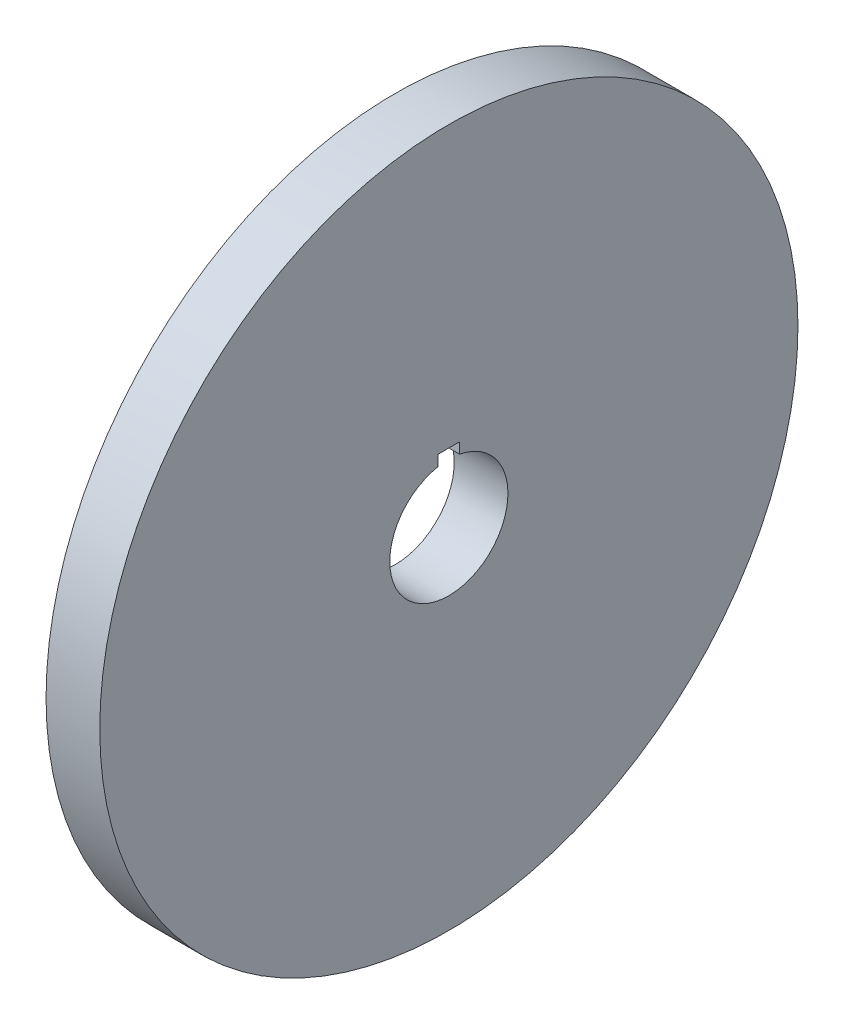
ISO-10303-21;
HEADER;
FILE_DESCRIPTION(('STEP AP214'),'2;1');
FILE_NAME('part.step','',(''),(''),'','','');
FILE_SCHEMA(('AUTOMOTIVE_DESIGN { 1 0 10303 214 1 1 1 1 }'));
ENDSEC;
DATA;
#1=APPLICATION_CONTEXT('core data for automotive mechanical design processes');
#2=APPLICATION_PROTOCOL_DEFINITION('international standard','automotive_design',2000,#1);
#3=PRODUCT_CONTEXT('',#1,'mechanical');
#4=PRODUCT('Part','Part','',(#3));
#5=PRODUCT_RELATED_PRODUCT_CATEGORY('part','',(#4));
#6=PRODUCT_DEFINITION_FORMATION('','',#4);
#7=PRODUCT_DEFINITION_CONTEXT('part definition',#1,'design');
#8=PRODUCT_DEFINITION('design','',#6,#7);
#9=PRODUCT_DEFINITION_SHAPE('','',#8);
#10=(LENGTH_UNIT() NAMED_UNIT(*) SI_UNIT(.MILLI.,.METRE.));
#11=(NAMED_UNIT(*) PLANE_ANGLE_UNIT() SI_UNIT($,.RADIAN.));
#12=(NAMED_UNIT(*) SI_UNIT($,.STERADIAN.) SOLID_ANGLE_UNIT());
#13=UNCERTAINTY_MEASURE_WITH_UNIT(LENGTH_MEASURE(1.E-05),#10,'distance_accuracy_value','');
#14=(GEOMETRIC_REPRESENTATION_CONTEXT(3) GLOBAL_UNCERTAINTY_ASSIGNED_CONTEXT((#13)) GLOBAL_UNIT_ASSIGNED_CONTEXT((#10,
#11,#12)) REPRESENTATION_CONTEXT('',''));
#15=CARTESIAN_POINT('',(0.,0.,0.));
#16=DIRECTION('',(0.,0.,1.));
#17=DIRECTION('',(1.,0.,0.));
#18=AXIS2_PLACEMENT_3D('',#15,#16,#17);
#19=CARTESIAN_POINT('',(5.,0.,0.));
#20=DIRECTION('',(1.,0.,0.));
#21=DIRECTION('',(0.,0.,-1.));
#22=AXIS2_PLACEMENT_3D('',#19,#20,#21);
#23=PLANE('',#22);
#24=CARTESIAN_POINT('',(5.,0.,0.));
#25=DIRECTION('',(1.,0.,0.));
#26=DIRECTION('',(0.,0.,-1.));
#27=AXIS2_PLACEMENT_3D('',#24,#25,#26);
#28=CIRCLE('',#27,65.);
#29=CARTESIAN_POINT('',(5.,0.,-65.));
#30=VERTEX_POINT('',#29);
#31=EDGE_CURVE('E11',#30,#30,#28,.T.);
#32=ORIENTED_EDGE('',*,*,#31,.T.);
#33=EDGE_LOOP('',(#32));
#34=FACE_BOUND('',#33,.T.);
#35=CARTESIAN_POINT('',(5.,0.,0.));
#36=DIRECTION('',(1.,0.,0.));
#37=DIRECTION('',(0.,0.,-1.));
#38=AXIS2_PLACEMENT_3D('',#35,#36,#37);
#39=CIRCLE('',#38,11.);
#40=CARTESIAN_POINT('',(5.,10.816653826392,2.));
#41=VERTEX_POINT('',#40);
#42=CARTESIAN_POINT('',(5.,10.816653826392,-2.));
#43=VERTEX_POINT('',#42);
#44=EDGE_CURVE('E98',#41,#43,#39,.T.);
#45=ORIENTED_EDGE('',*,*,#44,.F.);
#46=DIRECTION('',(0.,1.,0.));
#47=VECTOR('',#46,1.);
#48=CARTESIAN_POINT('',(5.,10.816653826392,2.));
#49=LINE('',#48,#47);
#50=CARTESIAN_POINT('',(5.,12.816653826392,2.));
#51=VERTEX_POINT('',#50);
#52=EDGE_CURVE('E82',#41,#51,#49,.T.);
#53=ORIENTED_EDGE('',*,*,#52,.T.);
#54=DIRECTION('',(0.,0.,-1.));
#55=VECTOR('',#54,1.);
#56=CARTESIAN_POINT('',(5.,12.816653826392,2.));
#57=LINE('',#56,#55);
#58=CARTESIAN_POINT('',(5.,12.816653826392,-2.));
#59=VERTEX_POINT('',#58);
#60=EDGE_CURVE('E97',#51,#59,#57,.T.);
#61=ORIENTED_EDGE('',*,*,#60,.T.);
#62=DIRECTION('',(0.,1.,0.));
#63=VECTOR('',#62,1.);
#64=CARTESIAN_POINT('',(5.,10.816653826392,-2.));
#65=LINE('',#64,#63);
#66=EDGE_CURVE('E92',#43,#59,#65,.T.);
#67=ORIENTED_EDGE('',*,*,#66,.F.);
#68=EDGE_LOOP('',(#45,#53,#61,#67));
#69=FACE_BOUND('',#68,.T.);
#70=ADVANCED_FACE('F41',(#34,#69),#23,.T.);
#71=CARTESIAN_POINT('',(-5.,0.,0.));
#72=DIRECTION('',(1.,0.,0.));
#73=DIRECTION('',(0.,0.,-1.));
#74=AXIS2_PLACEMENT_3D('',#71,#72,#73);
#75=PLANE('',#74);
#76=CARTESIAN_POINT('',(-5.,0.,0.));
#77=DIRECTION('',(1.,0.,0.));
#78=DIRECTION('',(0.,0.,-1.));
#79=AXIS2_PLACEMENT_3D('',#76,#77,#78);
#80=CIRCLE('',#79,65.);
#81=CARTESIAN_POINT('',(-5.,0.,-65.));
#82=VERTEX_POINT('',#81);
#83=EDGE_CURVE('E45',#82,#82,#80,.T.);
#84=ORIENTED_EDGE('',*,*,#83,.F.);
#85=EDGE_LOOP('',(#84));
#86=FACE_BOUND('',#85,.T.);
#87=DIRECTION('',(0.,1.,0.));
#88=VECTOR('',#87,1.);
#89=CARTESIAN_POINT('',(-5.,10.816653826392,2.));
#90=LINE('',#89,#88);
#91=CARTESIAN_POINT('',(-5.,10.816653826392,2.));
#92=VERTEX_POINT('',#91);
#93=CARTESIAN_POINT('',(-5.,12.816653826392,2.));
#94=VERTEX_POINT('',#93);
#95=EDGE_CURVE('E83',#92,#94,#90,.T.);
#96=ORIENTED_EDGE('',*,*,#95,.F.);
#97=CARTESIAN_POINT('',(-5.,0.,0.));
#98=DIRECTION('',(1.,0.,0.));
#99=DIRECTION('',(0.,0.,-1.));
#100=AXIS2_PLACEMENT_3D('',#97,#98,#99);
#101=CIRCLE('',#100,11.);
#102=CARTESIAN_POINT('',(-5.,10.816653826392,-2.));
#103=VERTEX_POINT('',#102);
#104=EDGE_CURVE('E113',#92,#103,#101,.T.);
#105=ORIENTED_EDGE('',*,*,#104,.T.);
#106=DIRECTION('',(0.,1.,0.));
#107=VECTOR('',#106,1.);
#108=CARTESIAN_POINT('',(-5.,10.816653826392,-2.));
#109=LINE('',#108,#107);
#110=CARTESIAN_POINT('',(-5.,12.816653826392,-2.));
#111=VERTEX_POINT('',#110);
#112=EDGE_CURVE('E56',#103,#111,#109,.T.);
#113=ORIENTED_EDGE('',*,*,#112,.T.);
#114=DIRECTION('',(0.,0.,-1.));
#115=VECTOR('',#114,1.);
#116=CARTESIAN_POINT('',(-5.,12.816653826392,2.));
#117=LINE('',#116,#115);
#118=EDGE_CURVE('E91',#94,#111,#117,.T.);
#119=ORIENTED_EDGE('',*,*,#118,.F.);
#120=EDGE_LOOP('',(#96,#105,#113,#119));
#121=FACE_BOUND('',#120,.T.);
#122=ADVANCED_FACE('F101',(#86,#121),#75,.F.);
#123=CARTESIAN_POINT('',(-5.,0.,0.));
#124=DIRECTION('',(1.,0.,0.));
#125=DIRECTION('',(0.,0.,-1.));
#126=AXIS2_PLACEMENT_3D('',#123,#124,#125);
#127=CYLINDRICAL_SURFACE('',#126,11.);
#128=DIRECTION('',(1.,0.,0.));
#129=VECTOR('',#128,1.);
#130=CARTESIAN_POINT('',(-5.,10.816653826392,2.));
#131=LINE('',#130,#129);
#132=EDGE_CURVE('E65',#92,#41,#131,.T.);
#133=ORIENTED_EDGE('',*,*,#132,.T.);
#134=ORIENTED_EDGE('',*,*,#44,.T.);
#135=DIRECTION('',(1.,0.,0.));
#136=VECTOR('',#135,1.);
#137=CARTESIAN_POINT('',(-5.,10.816653826392,-2.));
#138=LINE('',#137,#136);
#139=EDGE_CURVE('E110',#103,#43,#138,.T.);
#140=ORIENTED_EDGE('',*,*,#139,.F.);
#141=ORIENTED_EDGE('',*,*,#104,.F.);
#142=EDGE_LOOP('',(#133,#134,#140,#141));
#143=FACE_BOUND('',#142,.T.);
#144=ADVANCED_FACE('F118',(#143),#127,.F.);
#145=CARTESIAN_POINT('',(5.,0.,0.));
#146=DIRECTION('',(-1.,0.,0.));
#147=DIRECTION('',(0.,0.,1.));
#148=AXIS2_PLACEMENT_3D('',#145,#146,#147);
#149=CYLINDRICAL_SURFACE('',#148,65.);
#150=ORIENTED_EDGE('',*,*,#31,.F.);
#151=EDGE_LOOP('',(#150));
#152=FACE_BOUND('',#151,.T.);
#153=ORIENTED_EDGE('',*,*,#83,.T.);
#154=EDGE_LOOP('',(#153));
#155=FACE_BOUND('',#154,.T.);
#156=ADVANCED_FACE('F43',(#152,#155),#149,.T.);
#157=CARTESIAN_POINT('',(-5.,10.816653826392,2.));
#158=DIRECTION('',(0.,0.,-1.));
#159=DIRECTION('',(-1.,0.,0.));
#160=AXIS2_PLACEMENT_3D('',#157,#158,#159);
#161=PLANE('',#160);
#162=ORIENTED_EDGE('',*,*,#52,.F.);
#163=ORIENTED_EDGE('',*,*,#132,.F.);
#164=ORIENTED_EDGE('',*,*,#95,.T.);
#165=DIRECTION('',(1.,0.,0.));
#166=VECTOR('',#165,1.);
#167=CARTESIAN_POINT('',(-5.,12.816653826392,2.));
#168=LINE('',#167,#166);
#169=EDGE_CURVE('E86',#94,#51,#168,.T.);
#170=ORIENTED_EDGE('',*,*,#169,.T.);
#171=EDGE_LOOP('',(#162,#163,#164,#170));
#172=FACE_BOUND('',#171,.T.);
#173=ADVANCED_FACE('F85',(#172),#161,.T.);
#174=CARTESIAN_POINT('',(-5.,12.816653826392,2.));
#175=DIRECTION('',(0.,-1.,0.));
#176=DIRECTION('',(0.,0.,-1.));
#177=AXIS2_PLACEMENT_3D('',#174,#175,#176);
#178=PLANE('',#177);
#179=ORIENTED_EDGE('',*,*,#60,.F.);
#180=ORIENTED_EDGE('',*,*,#169,.F.);
#181=ORIENTED_EDGE('',*,*,#118,.T.);
#182=DIRECTION('',(1.,0.,0.));
#183=VECTOR('',#182,1.);
#184=CARTESIAN_POINT('',(-5.,12.816653826392,-2.));
#185=LINE('',#184,#183);
#186=EDGE_CURVE('E99',#111,#59,#185,.T.);
#187=ORIENTED_EDGE('',*,*,#186,.T.);
#188=EDGE_LOOP('',(#179,#180,#181,#187));
#189=FACE_BOUND('',#188,.T.);
#190=ADVANCED_FACE('F95',(#189),#178,.T.);
#191=CARTESIAN_POINT('',(-5.,10.816653826392,-2.));
#192=DIRECTION('',(0.,0.,-1.));
#193=DIRECTION('',(-1.,0.,0.));
#194=AXIS2_PLACEMENT_3D('',#191,#192,#193);
#195=PLANE('',#194);
#196=ORIENTED_EDGE('',*,*,#66,.T.);
#197=ORIENTED_EDGE('',*,*,#186,.F.);
#198=ORIENTED_EDGE('',*,*,#112,.F.);
#199=ORIENTED_EDGE('',*,*,#139,.T.);
#200=EDGE_LOOP('',(#196,#197,#198,#199));
#201=FACE_BOUND('',#200,.T.);
#202=ADVANCED_FACE('F121',(#201),#195,.F.);
#203=CLOSED_SHELL('',(#70,#122,#144,#156,#173,#190,#202));
#204=MANIFOLD_SOLID_BREP('B2',#203);
#205=ADVANCED_BREP_SHAPE_REPRESENTATION('',(#18,#204),#14);
#206=SHAPE_DEFINITION_REPRESENTATION(#9,#205);
ENDSEC;
END-ISO-10303-21;
